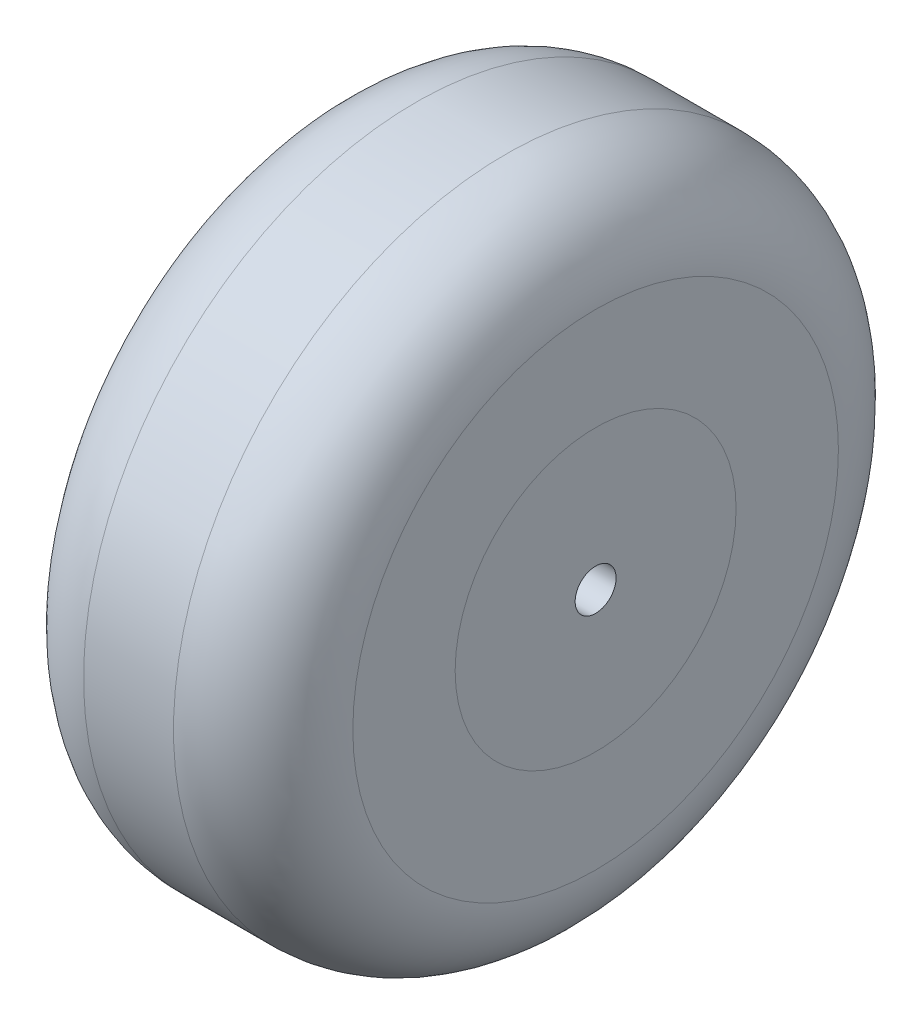
ISO-10303-21;
HEADER;
FILE_DESCRIPTION(('STEP AP214'),'2;1');
FILE_NAME('part.step','',(''),(''),'','','');
FILE_SCHEMA(('AUTOMOTIVE_DESIGN { 1 0 10303 214 1 1 1 1 }'));
ENDSEC;
DATA;
#1=APPLICATION_CONTEXT('core data for automotive mechanical design processes');
#2=APPLICATION_PROTOCOL_DEFINITION('international standard','automotive_design',2000,#1);
#3=PRODUCT_CONTEXT('',#1,'mechanical');
#4=PRODUCT('Part','Part','',(#3));
#5=PRODUCT_RELATED_PRODUCT_CATEGORY('part','',(#4));
#6=PRODUCT_DEFINITION_FORMATION('','',#4);
#7=PRODUCT_DEFINITION_CONTEXT('part definition',#1,'design');
#8=PRODUCT_DEFINITION('design','',#6,#7);
#9=PRODUCT_DEFINITION_SHAPE('','',#8);
#10=(LENGTH_UNIT() NAMED_UNIT(*) SI_UNIT(.MILLI.,.METRE.));
#11=(NAMED_UNIT(*) PLANE_ANGLE_UNIT() SI_UNIT($,.RADIAN.));
#12=(NAMED_UNIT(*) SI_UNIT($,.STERADIAN.) SOLID_ANGLE_UNIT());
#13=UNCERTAINTY_MEASURE_WITH_UNIT(LENGTH_MEASURE(1.E-05),#10,'distance_accuracy_value','');
#14=(GEOMETRIC_REPRESENTATION_CONTEXT(3) GLOBAL_UNCERTAINTY_ASSIGNED_CONTEXT((#13)) GLOBAL_UNIT_ASSIGNED_CONTEXT((#10,
#11,#12)) REPRESENTATION_CONTEXT('',''));
#15=CARTESIAN_POINT('',(0.,0.,0.));
#16=DIRECTION('',(0.,0.,1.));
#17=DIRECTION('',(1.,0.,0.));
#18=AXIS2_PLACEMENT_3D('',#15,#16,#17);
#19=CARTESIAN_POINT('',(0.,0.,0.));
#20=DIRECTION('',(1.,0.,0.));
#21=DIRECTION('',(0.,0.,-1.00000000000001));
#22=AXIS2_PLACEMENT_3D('',#19,#20,#21);
#23=CYLINDRICAL_SURFACE('',#22,15.24);
#24=CARTESIAN_POINT('',(0.,0.,0.));
#25=DIRECTION('',(1.,0.,0.));
#26=DIRECTION('',(0.,0.,-1.00000000000001));
#27=AXIS2_PLACEMENT_3D('',#24,#25,#26);
#28=CIRCLE('',#27,15.24);
#29=CARTESIAN_POINT('',(0.,0.,-15.2400000000001));
#30=VERTEX_POINT('',#29);
#31=EDGE_CURVE('E13',#30,#30,#28,.T.);
#32=ORIENTED_EDGE('',*,*,#31,.T.);
#33=EDGE_LOOP('',(#32));
#34=FACE_BOUND('',#33,.T.);
#35=CARTESIAN_POINT('',(29.21,0.,-3.33066907387547E-13));
#36=DIRECTION('',(1.,0.,0.));
#37=DIRECTION('',(0.,0.,-1.00000000000001));
#38=AXIS2_PLACEMENT_3D('',#35,#36,#37);
#39=CIRCLE('',#38,15.24);
#40=CARTESIAN_POINT('',(29.21,0.,-15.2400000000004));
#41=VERTEX_POINT('',#40);
#42=EDGE_CURVE('E61',#41,#41,#39,.T.);
#43=ORIENTED_EDGE('',*,*,#42,.F.);
#44=EDGE_LOOP('',(#43));
#45=FACE_BOUND('',#44,.T.);
#46=ADVANCED_FACE('F58',(#34,#45),#23,.T.);
#47=CARTESIAN_POINT('',(0.,0.,0.));
#48=DIRECTION('',(1.,0.,0.));
#49=DIRECTION('',(0.,0.,-1.00000000000001));
#50=AXIS2_PLACEMENT_3D('',#47,#48,#49);
#51=PLANE('',#50);
#52=CARTESIAN_POINT('',(0.,0.,0.));
#53=DIRECTION('',(1.,0.,0.));
#54=DIRECTION('',(0.,0.,-1.00000000000001));
#55=AXIS2_PLACEMENT_3D('',#52,#53,#54);
#56=CIRCLE('',#55,2.2225);
#57=CARTESIAN_POINT('',(0.,0.,-2.22250000000001));
#58=VERTEX_POINT('',#57);
#59=EDGE_CURVE('E68',#58,#58,#56,.T.);
#60=ORIENTED_EDGE('',*,*,#59,.T.);
#61=EDGE_LOOP('',(#60));
#62=FACE_BOUND('',#61,.T.);
#63=ORIENTED_EDGE('',*,*,#31,.F.);
#64=EDGE_LOOP('',(#63));
#65=FACE_BOUND('',#64,.T.);
#66=ADVANCED_FACE('F76',(#62,#65),#51,.F.);
#67=CARTESIAN_POINT('',(29.21,0.,-3.33066907387547E-13));
#68=DIRECTION('',(1.,0.,0.));
#69=DIRECTION('',(0.,0.,-1.00000000000001));
#70=AXIS2_PLACEMENT_3D('',#67,#68,#69);
#71=PLANE('',#70);
#72=CARTESIAN_POINT('',(29.21,0.,-3.33066907387547E-13));
#73=DIRECTION('',(1.,0.,0.));
#74=DIRECTION('',(0.,0.,-1.00000000000001));
#75=AXIS2_PLACEMENT_3D('',#72,#73,#74);
#76=CIRCLE('',#75,2.2225);
#77=CARTESIAN_POINT('',(29.21,0.,-2.22250000000034));
#78=VERTEX_POINT('',#77);
#79=EDGE_CURVE('E70',#78,#78,#76,.T.);
#80=ORIENTED_EDGE('',*,*,#79,.F.);
#81=EDGE_LOOP('',(#80));
#82=FACE_BOUND('',#81,.T.);
#83=ORIENTED_EDGE('',*,*,#42,.T.);
#84=EDGE_LOOP('',(#83));
#85=FACE_BOUND('',#84,.T.);
#86=ADVANCED_FACE('F82',(#82,#85),#71,.T.);
#87=CARTESIAN_POINT('',(0.,0.,0.));
#88=DIRECTION('',(1.,0.,0.));
#89=DIRECTION('',(0.,0.,-1.00000000000001));
#90=AXIS2_PLACEMENT_3D('',#87,#88,#89);
#91=CYLINDRICAL_SURFACE('',#90,2.2225);
#92=ORIENTED_EDGE('',*,*,#59,.F.);
#93=EDGE_LOOP('',(#92));
#94=FACE_BOUND('',#93,.T.);
#95=ORIENTED_EDGE('',*,*,#79,.T.);
#96=EDGE_LOOP('',(#95));
#97=FACE_BOUND('',#96,.T.);
#98=ADVANCED_FACE('F79',(#94,#97),#91,.F.);
#99=CLOSED_SHELL('',(#46,#66,#86,#98));
#100=MANIFOLD_SOLID_BREP('B2',#99);
#101=CARTESIAN_POINT('',(9.72820000000002,0.,0.));
#102=DIRECTION('',(1.,0.,0.));
#103=DIRECTION('',(0.,0.,-1.00000000000001));
#104=AXIS2_PLACEMENT_3D('',#101,#102,#103);
#105=TOROIDAL_SURFACE('',#104,26.3398,9.7282);
#106=CARTESIAN_POINT('',(9.72820000000002,0.,0.));
#107=DIRECTION('',(1.,0.,0.));
#108=DIRECTION('',(0.,0.,-1.00000000000001));
#109=AXIS2_PLACEMENT_3D('',#106,#107,#108);
#110=CIRCLE('',#109,36.068);
#111=CARTESIAN_POINT('',(9.72820000000001,0.,-36.0680000000002));
#112=VERTEX_POINT('',#111);
#113=EDGE_CURVE('E123',#112,#112,#110,.T.);
#114=ORIENTED_EDGE('',*,*,#113,.F.);
#115=EDGE_LOOP('',(#114));
#116=FACE_BOUND('',#115,.T.);
#117=CARTESIAN_POINT('',(0.,0.,0.));
#118=DIRECTION('',(1.,0.,0.));
#119=DIRECTION('',(0.,0.,-1.00000000000001));
#120=AXIS2_PLACEMENT_3D('',#117,#118,#119);
#121=CIRCLE('',#120,26.3398);
#122=CARTESIAN_POINT('',(0.,0.,-26.3398000000001));
#123=VERTEX_POINT('',#122);
#124=EDGE_CURVE('E57',#123,#123,#121,.F.);
#125=ORIENTED_EDGE('',*,*,#124,.F.);
#126=EDGE_LOOP('',(#125));
#127=FACE_BOUND('',#126,.T.);
#128=ADVANCED_FACE('F117',(#116,#127),#105,.T.);
#129=CARTESIAN_POINT('',(19.4818,0.,-2.22044604925031E-13));
#130=DIRECTION('',(1.,0.,0.));
#131=DIRECTION('',(0.,0.,-1.00000000000001));
#132=AXIS2_PLACEMENT_3D('',#129,#130,#131);
#133=TOROIDAL_SURFACE('',#132,26.3398,9.7282);
#134=CARTESIAN_POINT('',(19.4818,0.,-2.22044604925031E-13));
#135=DIRECTION('',(1.,0.,0.));
#136=DIRECTION('',(0.,0.,-1.00000000000001));
#137=AXIS2_PLACEMENT_3D('',#134,#135,#136);
#138=CIRCLE('',#137,36.068);
#139=CARTESIAN_POINT('',(19.4818,0.,-36.0680000000004));
#140=VERTEX_POINT('',#139);
#141=EDGE_CURVE('E131',#140,#140,#138,.F.);
#142=ORIENTED_EDGE('',*,*,#141,.F.);
#143=EDGE_LOOP('',(#142));
#144=FACE_BOUND('',#143,.T.);
#145=CARTESIAN_POINT('',(29.21,0.,-3.33066907387547E-13));
#146=DIRECTION('',(1.,0.,0.));
#147=DIRECTION('',(0.,0.,-1.00000000000001));
#148=AXIS2_PLACEMENT_3D('',#145,#146,#147);
#149=CIRCLE('',#148,26.3398);
#150=CARTESIAN_POINT('',(29.21,0.,-26.3398000000005));
#151=VERTEX_POINT('',#150);
#152=EDGE_CURVE('E127',#151,#151,#149,.T.);
#153=ORIENTED_EDGE('',*,*,#152,.F.);
#154=EDGE_LOOP('',(#153));
#155=FACE_BOUND('',#154,.T.);
#156=ADVANCED_FACE('F158',(#144,#155),#133,.T.);
#157=CARTESIAN_POINT('',(29.21,0.,-3.33066907387547E-13));
#158=DIRECTION('',(-1.,0.,0.));
#159=DIRECTION('',(0.,0.,1.00000000000001));
#160=AXIS2_PLACEMENT_3D('',#157,#158,#159);
#161=CYLINDRICAL_SURFACE('',#160,36.068);
#162=ORIENTED_EDGE('',*,*,#113,.T.);
#163=EDGE_LOOP('',(#162));
#164=FACE_BOUND('',#163,.T.);
#165=ORIENTED_EDGE('',*,*,#141,.T.);
#166=EDGE_LOOP('',(#165));
#167=FACE_BOUND('',#166,.T.);
#168=ADVANCED_FACE('F154',(#164,#167),#161,.T.);
#169=CARTESIAN_POINT('',(29.21,0.,-3.33066907387547E-13));
#170=DIRECTION('',(1.,0.,0.));
#171=DIRECTION('',(0.,0.,-1.00000000000001));
#172=AXIS2_PLACEMENT_3D('',#169,#170,#171);
#173=PLANE('',#172);
#174=CARTESIAN_POINT('',(29.21,0.,-3.33066907387547E-13));
#175=DIRECTION('',(1.,0.,0.));
#176=DIRECTION('',(0.,0.,-1.00000000000001));
#177=AXIS2_PLACEMENT_3D('',#174,#175,#176);
#178=CIRCLE('',#177,15.24);
#179=CARTESIAN_POINT('',(29.21,0.,-15.2400000000004));
#180=VERTEX_POINT('',#179);
#181=EDGE_CURVE('E137',#180,#180,#178,.T.);
#182=ORIENTED_EDGE('',*,*,#181,.F.);
#183=EDGE_LOOP('',(#182));
#184=FACE_BOUND('',#183,.T.);
#185=ORIENTED_EDGE('',*,*,#152,.T.);
#186=EDGE_LOOP('',(#185));
#187=FACE_BOUND('',#186,.T.);
#188=ADVANCED_FACE('F151',(#184,#187),#173,.T.);
#189=CARTESIAN_POINT('',(0.,0.,0.));
#190=DIRECTION('',(1.,0.,0.));
#191=DIRECTION('',(0.,0.,-1.00000000000001));
#192=AXIS2_PLACEMENT_3D('',#189,#190,#191);
#193=PLANE('',#192);
#194=CARTESIAN_POINT('',(0.,0.,0.));
#195=DIRECTION('',(1.,0.,0.));
#196=DIRECTION('',(0.,0.,-1.00000000000001));
#197=AXIS2_PLACEMENT_3D('',#194,#195,#196);
#198=CIRCLE('',#197,15.24);
#199=CARTESIAN_POINT('',(0.,0.,-15.2400000000001));
#200=VERTEX_POINT('',#199);
#201=EDGE_CURVE('E136',#200,#200,#198,.T.);
#202=ORIENTED_EDGE('',*,*,#201,.T.);
#203=EDGE_LOOP('',(#202));
#204=FACE_BOUND('',#203,.T.);
#205=ORIENTED_EDGE('',*,*,#124,.T.);
#206=EDGE_LOOP('',(#205));
#207=FACE_BOUND('',#206,.T.);
#208=ADVANCED_FACE('F143',(#204,#207),#193,.F.);
#209=CARTESIAN_POINT('',(0.,0.,0.));
#210=DIRECTION('',(1.,0.,0.));
#211=DIRECTION('',(0.,0.,-1.00000000000001));
#212=AXIS2_PLACEMENT_3D('',#209,#210,#211);
#213=CYLINDRICAL_SURFACE('',#212,15.24);
#214=ORIENTED_EDGE('',*,*,#201,.F.);
#215=EDGE_LOOP('',(#214));
#216=FACE_BOUND('',#215,.T.);
#217=ORIENTED_EDGE('',*,*,#181,.T.);
#218=EDGE_LOOP('',(#217));
#219=FACE_BOUND('',#218,.T.);
#220=ADVANCED_FACE('F145',(#216,#219),#213,.F.);
#221=CLOSED_SHELL('',(#128,#156,#168,#188,#208,#220));
#222=MANIFOLD_SOLID_BREP('B8',#221);
#223=ADVANCED_BREP_SHAPE_REPRESENTATION('',(#18,#100,#222),#14);
#224=SHAPE_DEFINITION_REPRESENTATION(#9,#223);
ENDSEC;
END-ISO-10303-21;
